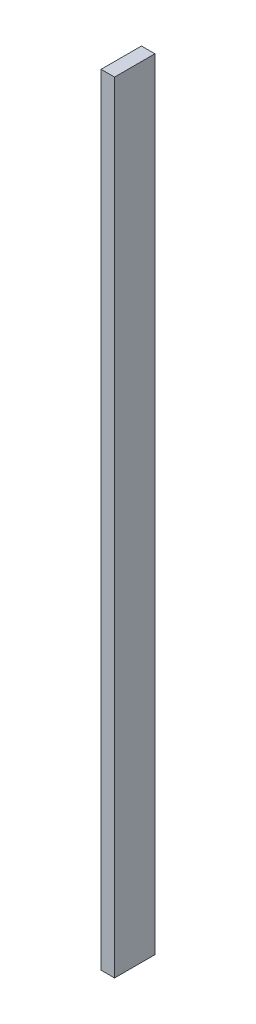
ISO-10303-21;
HEADER;
FILE_DESCRIPTION(('STEP AP214'),'2;1');
FILE_NAME('part.step','',(''),(''),'','','');
FILE_SCHEMA(('AUTOMOTIVE_DESIGN { 1 0 10303 214 1 1 1 1 }'));
ENDSEC;
DATA;
#1=APPLICATION_CONTEXT('core data for automotive mechanical design processes');
#2=APPLICATION_PROTOCOL_DEFINITION('international standard','automotive_design',2000,#1);
#3=PRODUCT_CONTEXT('',#1,'mechanical');
#4=PRODUCT('Part','Part','',(#3));
#5=PRODUCT_RELATED_PRODUCT_CATEGORY('part','',(#4));
#6=PRODUCT_DEFINITION_FORMATION('','',#4);
#7=PRODUCT_DEFINITION_CONTEXT('part definition',#1,'design');
#8=PRODUCT_DEFINITION('design','',#6,#7);
#9=PRODUCT_DEFINITION_SHAPE('','',#8);
#10=(LENGTH_UNIT() NAMED_UNIT(*) SI_UNIT(.MILLI.,.METRE.));
#11=(NAMED_UNIT(*) PLANE_ANGLE_UNIT() SI_UNIT($,.RADIAN.));
#12=(NAMED_UNIT(*) SI_UNIT($,.STERADIAN.) SOLID_ANGLE_UNIT());
#13=UNCERTAINTY_MEASURE_WITH_UNIT(LENGTH_MEASURE(1.E-05),#10,'distance_accuracy_value','');
#14=(GEOMETRIC_REPRESENTATION_CONTEXT(3) GLOBAL_UNCERTAINTY_ASSIGNED_CONTEXT((#13)) GLOBAL_UNIT_ASSIGNED_CONTEXT((#10,
#11,#12)) REPRESENTATION_CONTEXT('',''));
#15=CARTESIAN_POINT('',(0.,0.,0.));
#16=DIRECTION('',(0.,0.,1.));
#17=DIRECTION('',(1.,0.,0.));
#18=AXIS2_PLACEMENT_3D('',#15,#16,#17);
#19=CARTESIAN_POINT('',(10.,0.,30.));
#20=DIRECTION('',(-1.,0.,0.));
#21=DIRECTION('',(0.,0.,1.));
#22=AXIS2_PLACEMENT_3D('',#19,#20,#21);
#23=PLANE('',#22);
#24=DIRECTION('',(0.,0.,-1.));
#25=VECTOR('',#24,1.);
#26=CARTESIAN_POINT('',(10.,580.,30.));
#27=LINE('',#26,#25);
#28=CARTESIAN_POINT('',(10.,580.,0.));
#29=VERTEX_POINT('',#28);
#30=CARTESIAN_POINT('',(10.,580.,30.));
#31=VERTEX_POINT('',#30);
#32=EDGE_CURVE('E20',#29,#31,#27,.F.);
#33=ORIENTED_EDGE('',*,*,#32,.T.);
#34=DIRECTION('',(0.,1.,0.));
#35=VECTOR('',#34,1.);
#36=CARTESIAN_POINT('',(10.,0.,30.));
#37=LINE('',#36,#35);
#38=CARTESIAN_POINT('',(10.,0.,30.));
#39=VERTEX_POINT('',#38);
#40=EDGE_CURVE('E55',#31,#39,#37,.F.);
#41=ORIENTED_EDGE('',*,*,#40,.T.);
#42=DIRECTION('',(0.,0.,1.));
#43=VECTOR('',#42,1.);
#44=CARTESIAN_POINT('',(10.,0.,30.));
#45=LINE('',#44,#43);
#46=CARTESIAN_POINT('',(10.,0.,0.));
#47=VERTEX_POINT('',#46);
#48=EDGE_CURVE('E76',#39,#47,#45,.F.);
#49=ORIENTED_EDGE('',*,*,#48,.T.);
#50=DIRECTION('',(0.,1.,0.));
#51=VECTOR('',#50,1.);
#52=CARTESIAN_POINT('',(10.,0.,0.));
#53=LINE('',#52,#51);
#54=EDGE_CURVE('E58',#29,#47,#53,.F.);
#55=ORIENTED_EDGE('',*,*,#54,.F.);
#56=EDGE_LOOP('',(#33,#41,#49,#55));
#57=FACE_BOUND('',#56,.T.);
#58=ADVANCED_FACE('F17',(#57),#23,.F.);
#59=CARTESIAN_POINT('',(0.,580.,30.));
#60=DIRECTION('',(0.,-1.,0.));
#61=DIRECTION('',(0.,0.,-1.));
#62=AXIS2_PLACEMENT_3D('',#59,#60,#61);
#63=PLANE('',#62);
#64=DIRECTION('',(0.,0.,-1.));
#65=VECTOR('',#64,1.);
#66=CARTESIAN_POINT('',(0.,580.,30.));
#67=LINE('',#66,#65);
#68=CARTESIAN_POINT('',(0.,580.,0.));
#69=VERTEX_POINT('',#68);
#70=CARTESIAN_POINT('',(0.,580.,30.));
#71=VERTEX_POINT('',#70);
#72=EDGE_CURVE('E73',#69,#71,#67,.F.);
#73=ORIENTED_EDGE('',*,*,#72,.T.);
#74=DIRECTION('',(-1.,0.,0.));
#75=VECTOR('',#74,1.);
#76=CARTESIAN_POINT('',(0.,580.,30.));
#77=LINE('',#76,#75);
#78=EDGE_CURVE('E63',#71,#31,#77,.F.);
#79=ORIENTED_EDGE('',*,*,#78,.T.);
#80=ORIENTED_EDGE('',*,*,#32,.F.);
#81=DIRECTION('',(-1.,0.,0.));
#82=VECTOR('',#81,1.);
#83=CARTESIAN_POINT('',(0.,580.,0.));
#84=LINE('',#83,#82);
#85=EDGE_CURVE('E78',#69,#29,#84,.F.);
#86=ORIENTED_EDGE('',*,*,#85,.F.);
#87=EDGE_LOOP('',(#73,#79,#80,#86));
#88=FACE_BOUND('',#87,.T.);
#89=ADVANCED_FACE('F72',(#88),#63,.F.);
#90=CARTESIAN_POINT('',(0.,0.,30.));
#91=DIRECTION('',(0.,0.,-1.));
#92=DIRECTION('',(-1.,0.,0.));
#93=AXIS2_PLACEMENT_3D('',#90,#91,#92);
#94=PLANE('',#93);
#95=DIRECTION('',(1.,0.,0.));
#96=VECTOR('',#95,1.);
#97=CARTESIAN_POINT('',(0.,0.,30.));
#98=LINE('',#97,#96);
#99=CARTESIAN_POINT('',(0.,0.,30.));
#100=VERTEX_POINT('',#99);
#101=EDGE_CURVE('E69',#100,#39,#98,.T.);
#102=ORIENTED_EDGE('',*,*,#101,.T.);
#103=ORIENTED_EDGE('',*,*,#40,.F.);
#104=ORIENTED_EDGE('',*,*,#78,.F.);
#105=DIRECTION('',(0.,1.,0.));
#106=VECTOR('',#105,1.);
#107=CARTESIAN_POINT('',(0.,0.,30.));
#108=LINE('',#107,#106);
#109=EDGE_CURVE('E83',#71,#100,#108,.F.);
#110=ORIENTED_EDGE('',*,*,#109,.T.);
#111=EDGE_LOOP('',(#102,#103,#104,#110));
#112=FACE_BOUND('',#111,.T.);
#113=ADVANCED_FACE('F66',(#112),#94,.F.);
#114=CARTESIAN_POINT('',(0.,0.,30.));
#115=DIRECTION('',(0.,1.,0.));
#116=DIRECTION('',(0.,0.,1.));
#117=AXIS2_PLACEMENT_3D('',#114,#115,#116);
#118=PLANE('',#117);
#119=ORIENTED_EDGE('',*,*,#48,.F.);
#120=ORIENTED_EDGE('',*,*,#101,.F.);
#121=DIRECTION('',(0.,0.,-1.));
#122=VECTOR('',#121,1.);
#123=CARTESIAN_POINT('',(0.,0.,30.));
#124=LINE('',#123,#122);
#125=CARTESIAN_POINT('',(0.,0.,0.));
#126=VERTEX_POINT('',#125);
#127=EDGE_CURVE('E26',#100,#126,#124,.T.);
#128=ORIENTED_EDGE('',*,*,#127,.T.);
#129=DIRECTION('',(-1.,0.,0.));
#130=VECTOR('',#129,1.);
#131=CARTESIAN_POINT('',(0.,0.,0.));
#132=LINE('',#131,#130);
#133=EDGE_CURVE('E34',#47,#126,#132,.T.);
#134=ORIENTED_EDGE('',*,*,#133,.F.);
#135=EDGE_LOOP('',(#119,#120,#128,#134));
#136=FACE_BOUND('',#135,.T.);
#137=ADVANCED_FACE('F88',(#136),#118,.F.);
#138=CARTESIAN_POINT('',(0.,0.,0.));
#139=DIRECTION('',(0.,0.,-1.));
#140=DIRECTION('',(-1.,0.,0.));
#141=AXIS2_PLACEMENT_3D('',#138,#139,#140);
#142=PLANE('',#141);
#143=ORIENTED_EDGE('',*,*,#54,.T.);
#144=ORIENTED_EDGE('',*,*,#133,.T.);
#145=DIRECTION('',(0.,1.,0.));
#146=VECTOR('',#145,1.);
#147=CARTESIAN_POINT('',(0.,0.,0.));
#148=LINE('',#147,#146);
#149=EDGE_CURVE('E11',#126,#69,#148,.T.);
#150=ORIENTED_EDGE('',*,*,#149,.T.);
#151=ORIENTED_EDGE('',*,*,#85,.T.);
#152=EDGE_LOOP('',(#143,#144,#150,#151));
#153=FACE_BOUND('',#152,.T.);
#154=ADVANCED_FACE('F91',(#153),#142,.T.);
#155=CARTESIAN_POINT('',(0.,0.,30.));
#156=DIRECTION('',(1.,0.,0.));
#157=DIRECTION('',(0.,0.,-1.));
#158=AXIS2_PLACEMENT_3D('',#155,#156,#157);
#159=PLANE('',#158);
#160=ORIENTED_EDGE('',*,*,#127,.F.);
#161=ORIENTED_EDGE('',*,*,#109,.F.);
#162=ORIENTED_EDGE('',*,*,#72,.F.);
#163=ORIENTED_EDGE('',*,*,#149,.F.);
#164=EDGE_LOOP('',(#160,#161,#162,#163));
#165=FACE_BOUND('',#164,.T.);
#166=ADVANCED_FACE('F90',(#165),#159,.F.);
#167=CLOSED_SHELL('',(#58,#89,#113,#137,#154,#166));
#168=MANIFOLD_SOLID_BREP('B1',#167);
#169=ADVANCED_BREP_SHAPE_REPRESENTATION('',(#18,#168),#14);
#170=SHAPE_DEFINITION_REPRESENTATION(#9,#169);
ENDSEC;
END-ISO-10303-21;
